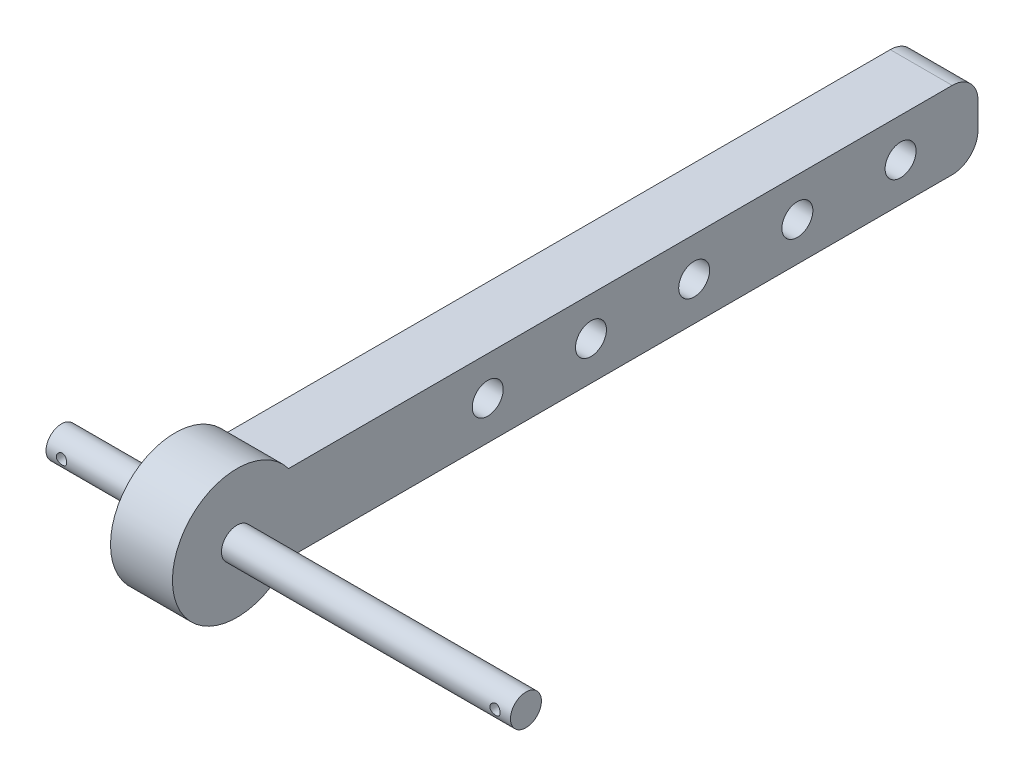
ISO-10303-21;
HEADER;
FILE_DESCRIPTION(('STEP AP214'),'2;1');
FILE_NAME('part.step','',(''),(''),'','','');
FILE_SCHEMA(('AUTOMOTIVE_DESIGN { 1 0 10303 214 1 1 1 1 }'));
ENDSEC;
DATA;
#1=APPLICATION_CONTEXT('core data for automotive mechanical design processes');
#2=APPLICATION_PROTOCOL_DEFINITION('international standard','automotive_design',2000,#1);
#3=PRODUCT_CONTEXT('',#1,'mechanical');
#4=PRODUCT('Part','Part','',(#3));
#5=PRODUCT_RELATED_PRODUCT_CATEGORY('part','',(#4));
#6=PRODUCT_DEFINITION_FORMATION('','',#4);
#7=PRODUCT_DEFINITION_CONTEXT('part definition',#1,'design');
#8=PRODUCT_DEFINITION('design','',#6,#7);
#9=PRODUCT_DEFINITION_SHAPE('','',#8);
#10=(LENGTH_UNIT() NAMED_UNIT(*) SI_UNIT(.MILLI.,.METRE.));
#11=(NAMED_UNIT(*) PLANE_ANGLE_UNIT() SI_UNIT($,.RADIAN.));
#12=(NAMED_UNIT(*) SI_UNIT($,.STERADIAN.) SOLID_ANGLE_UNIT());
#13=UNCERTAINTY_MEASURE_WITH_UNIT(LENGTH_MEASURE(1.E-05),#10,'distance_accuracy_value','');
#14=(GEOMETRIC_REPRESENTATION_CONTEXT(3) GLOBAL_UNCERTAINTY_ASSIGNED_CONTEXT((#13)) GLOBAL_UNIT_ASSIGNED_CONTEXT((#10,
#11,#12)) REPRESENTATION_CONTEXT('',''));
#15=CARTESIAN_POINT('',(0.,0.,0.));
#16=DIRECTION('',(0.,0.,1.));
#17=DIRECTION('',(1.,0.,0.));
#18=AXIS2_PLACEMENT_3D('',#15,#16,#17);
#19=CARTESIAN_POINT('',(12.,0.,0.));
#20=DIRECTION('',(0.,1.,0.));
#21=DIRECTION('',(0.,0.,1.));
#22=AXIS2_PLACEMENT_3D('',#19,#20,#21);
#23=PLANE('',#22);
#24=DIRECTION('',(0.,0.,-1.));
#25=VECTOR('',#24,1.);
#26=CARTESIAN_POINT('',(12.,0.,0.));
#27=LINE('',#26,#25);
#28=CARTESIAN_POINT('',(12.,0.,-16.4));
#29=VERTEX_POINT('',#28);
#30=CARTESIAN_POINT('',(12.,0.,-145.));
#31=VERTEX_POINT('',#30);
#32=EDGE_CURVE('E61',#29,#31,#27,.T.);
#33=ORIENTED_EDGE('',*,*,#32,.F.);
#34=DIRECTION('',(1.,0.,0.));
#35=VECTOR('',#34,1.);
#36=CARTESIAN_POINT('',(-35.3553390593274,0.,-16.4));
#37=LINE('',#36,#35);
#38=CARTESIAN_POINT('',(0.,0.,-16.4));
#39=VERTEX_POINT('',#38);
#40=EDGE_CURVE('E98',#29,#39,#37,.F.);
#41=ORIENTED_EDGE('',*,*,#40,.T.);
#42=DIRECTION('',(0.,0.,-1.));
#43=VECTOR('',#42,1.);
#44=CARTESIAN_POINT('',(0.,0.,0.));
#45=LINE('',#44,#43);
#46=CARTESIAN_POINT('',(0.,0.,-145.));
#47=VERTEX_POINT('',#46);
#48=EDGE_CURVE('E120',#39,#47,#45,.T.);
#49=ORIENTED_EDGE('',*,*,#48,.T.);
#50=DIRECTION('',(-1.,0.,0.));
#51=VECTOR('',#50,1.);
#52=CARTESIAN_POINT('',(12.,0.,-145.));
#53=LINE('',#52,#51);
#54=EDGE_CURVE('E133',#47,#31,#53,.F.);
#55=ORIENTED_EDGE('',*,*,#54,.T.);
#56=EDGE_LOOP('',(#33,#41,#49,#55));
#57=FACE_BOUND('',#56,.T.);
#58=ADVANCED_FACE('F39',(#57),#23,.F.);
#59=CARTESIAN_POINT('',(12.,0.,-150.));
#60=DIRECTION('',(0.,0.,1.));
#61=DIRECTION('',(1.,0.,0.));
#62=AXIS2_PLACEMENT_3D('',#59,#60,#61);
#63=PLANE('',#62);
#64=DIRECTION('',(0.,1.,0.));
#65=VECTOR('',#64,1.);
#66=CARTESIAN_POINT('',(12.,0.,-150.));
#67=LINE('',#66,#65);
#68=CARTESIAN_POINT('',(12.,5.,-150.));
#69=VERTEX_POINT('',#68);
#70=CARTESIAN_POINT('',(12.,10.,-150.));
#71=VERTEX_POINT('',#70);
#72=EDGE_CURVE('E113',#69,#71,#67,.T.);
#73=ORIENTED_EDGE('',*,*,#72,.F.);
#74=DIRECTION('',(-1.,0.,0.));
#75=VECTOR('',#74,1.);
#76=CARTESIAN_POINT('',(12.,5.,-150.));
#77=LINE('',#76,#75);
#78=CARTESIAN_POINT('',(0.,5.,-150.));
#79=VERTEX_POINT('',#78);
#80=EDGE_CURVE('E115',#69,#79,#77,.T.);
#81=ORIENTED_EDGE('',*,*,#80,.T.);
#82=DIRECTION('',(0.,1.,0.));
#83=VECTOR('',#82,1.);
#84=CARTESIAN_POINT('',(0.,0.,-150.));
#85=LINE('',#84,#83);
#86=CARTESIAN_POINT('',(0.,10.,-150.));
#87=VERTEX_POINT('',#86);
#88=EDGE_CURVE('E122',#79,#87,#85,.T.);
#89=ORIENTED_EDGE('',*,*,#88,.T.);
#90=DIRECTION('',(-1.,0.,0.));
#91=VECTOR('',#90,1.);
#92=CARTESIAN_POINT('',(12.,10.,-150.));
#93=LINE('',#92,#91);
#94=EDGE_CURVE('E112',#87,#71,#93,.F.);
#95=ORIENTED_EDGE('',*,*,#94,.T.);
#96=EDGE_LOOP('',(#73,#81,#89,#95));
#97=FACE_BOUND('',#96,.T.);
#98=ADVANCED_FACE('F153',(#97),#63,.F.);
#99=CARTESIAN_POINT('',(12.,15.,0.));
#100=DIRECTION('',(0.,-1.,0.));
#101=DIRECTION('',(0.,0.,-1.));
#102=AXIS2_PLACEMENT_3D('',#99,#100,#101);
#103=PLANE('',#102);
#104=DIRECTION('',(0.,0.,1.));
#105=VECTOR('',#104,1.);
#106=CARTESIAN_POINT('',(0.,15.,0.));
#107=LINE('',#106,#105);
#108=CARTESIAN_POINT('',(0.,15.,-145.));
#109=VERTEX_POINT('',#108);
#110=CARTESIAN_POINT('',(0.,15.,-16.4));
#111=VERTEX_POINT('',#110);
#112=EDGE_CURVE('E109',#109,#111,#107,.T.);
#113=ORIENTED_EDGE('',*,*,#112,.T.);
#114=DIRECTION('',(1.,0.,0.));
#115=VECTOR('',#114,1.);
#116=CARTESIAN_POINT('',(-35.3553390593274,15.,-16.4));
#117=LINE('',#116,#115);
#118=CARTESIAN_POINT('',(12.,15.,-16.4));
#119=VERTEX_POINT('',#118);
#120=EDGE_CURVE('E95',#111,#119,#117,.T.);
#121=ORIENTED_EDGE('',*,*,#120,.T.);
#122=DIRECTION('',(0.,0.,1.));
#123=VECTOR('',#122,1.);
#124=CARTESIAN_POINT('',(12.,15.,0.));
#125=LINE('',#124,#123);
#126=CARTESIAN_POINT('',(12.,15.,-145.));
#127=VERTEX_POINT('',#126);
#128=EDGE_CURVE('E106',#127,#119,#125,.T.);
#129=ORIENTED_EDGE('',*,*,#128,.F.);
#130=DIRECTION('',(-1.,0.,0.));
#131=VECTOR('',#130,1.);
#132=CARTESIAN_POINT('',(12.,15.,-145.));
#133=LINE('',#132,#131);
#134=EDGE_CURVE('E47',#127,#109,#133,.T.);
#135=ORIENTED_EDGE('',*,*,#134,.T.);
#136=EDGE_LOOP('',(#113,#121,#129,#135));
#137=FACE_BOUND('',#136,.T.);
#138=ADVANCED_FACE('F104',(#137),#103,.F.);
#139=CARTESIAN_POINT('',(12.,0.,0.));
#140=DIRECTION('',(-1.,0.,0.));
#141=DIRECTION('',(0.,0.,1.));
#142=AXIS2_PLACEMENT_3D('',#139,#140,#141);
#143=PLANE('',#142);
#144=CARTESIAN_POINT('',(12.,7.5,-135.));
#145=DIRECTION('',(-1.,0.,0.));
#146=DIRECTION('',(0.,0.,1.));
#147=AXIS2_PLACEMENT_3D('',#144,#145,#146);
#148=CIRCLE('',#147,2.99999999999999);
#149=CARTESIAN_POINT('',(12.,7.5,-132.));
#150=VERTEX_POINT('',#149);
#151=EDGE_CURVE('E233',#150,#150,#148,.F.);
#152=ORIENTED_EDGE('',*,*,#151,.F.);
#153=EDGE_LOOP('',(#152));
#154=FACE_BOUND('',#153,.T.);
#155=CARTESIAN_POINT('',(12.,7.5,-115.));
#156=DIRECTION('',(-1.,0.,0.));
#157=DIRECTION('',(0.,0.,1.));
#158=AXIS2_PLACEMENT_3D('',#155,#156,#157);
#159=CIRCLE('',#158,3.00000000000001);
#160=CARTESIAN_POINT('',(12.,7.5,-112.));
#161=VERTEX_POINT('',#160);
#162=EDGE_CURVE('E240',#161,#161,#159,.F.);
#163=ORIENTED_EDGE('',*,*,#162,.F.);
#164=EDGE_LOOP('',(#163));
#165=FACE_BOUND('',#164,.T.);
#166=CARTESIAN_POINT('',(12.,7.5,-95.));
#167=DIRECTION('',(-1.,0.,0.));
#168=DIRECTION('',(0.,0.,1.));
#169=AXIS2_PLACEMENT_3D('',#166,#167,#168);
#170=CIRCLE('',#169,3.00000000000001);
#171=CARTESIAN_POINT('',(12.,7.5,-92.));
#172=VERTEX_POINT('',#171);
#173=EDGE_CURVE('E246',#172,#172,#170,.F.);
#174=ORIENTED_EDGE('',*,*,#173,.F.);
#175=EDGE_LOOP('',(#174));
#176=FACE_BOUND('',#175,.T.);
#177=CARTESIAN_POINT('',(12.,7.5,-75.));
#178=DIRECTION('',(-1.,0.,0.));
#179=DIRECTION('',(0.,0.,1.));
#180=AXIS2_PLACEMENT_3D('',#177,#178,#179);
#181=CIRCLE('',#180,3.00000000000001);
#182=CARTESIAN_POINT('',(12.,7.5,-72.));
#183=VERTEX_POINT('',#182);
#184=EDGE_CURVE('E252',#183,#183,#181,.F.);
#185=ORIENTED_EDGE('',*,*,#184,.F.);
#186=EDGE_LOOP('',(#185));
#187=FACE_BOUND('',#186,.T.);
#188=CARTESIAN_POINT('',(12.,7.5,-55.));
#189=DIRECTION('',(-1.,0.,0.));
#190=DIRECTION('',(0.,0.,1.));
#191=AXIS2_PLACEMENT_3D('',#188,#189,#190);
#192=CIRCLE('',#191,3.);
#193=CARTESIAN_POINT('',(12.,7.5,-52.));
#194=VERTEX_POINT('',#193);
#195=EDGE_CURVE('E258',#194,#194,#192,.F.);
#196=ORIENTED_EDGE('',*,*,#195,.F.);
#197=EDGE_LOOP('',(#196));
#198=FACE_BOUND('',#197,.T.);
#199=CARTESIAN_POINT('',(12.,7.5,-6.4));
#200=DIRECTION('',(-1.,0.,0.));
#201=DIRECTION('',(0.,0.,1.));
#202=AXIS2_PLACEMENT_3D('',#199,#200,#201);
#203=CIRCLE('',#202,3.);
#204=CARTESIAN_POINT('',(12.,7.5,-3.4));
#205=VERTEX_POINT('',#204);
#206=EDGE_CURVE('E100',#205,#205,#203,.T.);
#207=ORIENTED_EDGE('',*,*,#206,.T.);
#208=EDGE_LOOP('',(#207));
#209=FACE_BOUND('',#208,.T.);
#210=CARTESIAN_POINT('',(12.,7.5,-6.4));
#211=DIRECTION('',(1.,0.,0.));
#212=DIRECTION('',(0.,0.,-1.));
#213=AXIS2_PLACEMENT_3D('',#210,#211,#212);
#214=CIRCLE('',#213,12.5);
#215=EDGE_CURVE('E92',#119,#29,#214,.T.);
#216=ORIENTED_EDGE('',*,*,#215,.T.);
#217=ORIENTED_EDGE('',*,*,#32,.T.);
#218=CARTESIAN_POINT('',(12.,5.,-145.));
#219=DIRECTION('',(-1.,0.,0.));
#220=DIRECTION('',(0.,0.,1.));
#221=AXIS2_PLACEMENT_3D('',#218,#219,#220);
#222=CIRCLE('',#221,5.);
#223=EDGE_CURVE('E136',#31,#69,#222,.F.);
#224=ORIENTED_EDGE('',*,*,#223,.T.);
#225=ORIENTED_EDGE('',*,*,#72,.T.);
#226=CARTESIAN_POINT('',(12.,10.,-145.));
#227=DIRECTION('',(-1.,0.,0.));
#228=DIRECTION('',(0.,0.,1.));
#229=AXIS2_PLACEMENT_3D('',#226,#227,#228);
#230=CIRCLE('',#229,5.);
#231=EDGE_CURVE('E54',#71,#127,#230,.F.);
#232=ORIENTED_EDGE('',*,*,#231,.T.);
#233=ORIENTED_EDGE('',*,*,#128,.T.);
#234=EDGE_LOOP('',(#216,#217,#224,#225,#232,#233));
#235=FACE_BOUND('',#234,.T.);
#236=ADVANCED_FACE('F111',(#154,#165,#176,#187,#198,#209,#235),#143,.F.);
#237=CARTESIAN_POINT('',(0.,0.,0.));
#238=DIRECTION('',(-1.,0.,0.));
#239=DIRECTION('',(0.,0.,1.));
#240=AXIS2_PLACEMENT_3D('',#237,#238,#239);
#241=PLANE('',#240);
#242=CARTESIAN_POINT('',(0.,7.5,-135.));
#243=DIRECTION('',(-1.,0.,0.));
#244=DIRECTION('',(0.,0.,1.));
#245=AXIS2_PLACEMENT_3D('',#242,#243,#244);
#246=CIRCLE('',#245,2.99999999999999);
#247=CARTESIAN_POINT('',(0.,7.5,-132.));
#248=VERTEX_POINT('',#247);
#249=EDGE_CURVE('E235',#248,#248,#246,.T.);
#250=ORIENTED_EDGE('',*,*,#249,.F.);
#251=EDGE_LOOP('',(#250));
#252=FACE_BOUND('',#251,.T.);
#253=CARTESIAN_POINT('',(0.,7.5,-115.));
#254=DIRECTION('',(-1.,0.,0.));
#255=DIRECTION('',(0.,0.,1.));
#256=AXIS2_PLACEMENT_3D('',#253,#254,#255);
#257=CIRCLE('',#256,3.00000000000001);
#258=CARTESIAN_POINT('',(0.,7.5,-112.));
#259=VERTEX_POINT('',#258);
#260=EDGE_CURVE('E243',#259,#259,#257,.T.);
#261=ORIENTED_EDGE('',*,*,#260,.F.);
#262=EDGE_LOOP('',(#261));
#263=FACE_BOUND('',#262,.T.);
#264=CARTESIAN_POINT('',(0.,7.5,-95.));
#265=DIRECTION('',(-1.,0.,0.));
#266=DIRECTION('',(0.,0.,1.));
#267=AXIS2_PLACEMENT_3D('',#264,#265,#266);
#268=CIRCLE('',#267,3.00000000000001);
#269=CARTESIAN_POINT('',(0.,7.5,-92.));
#270=VERTEX_POINT('',#269);
#271=EDGE_CURVE('E249',#270,#270,#268,.T.);
#272=ORIENTED_EDGE('',*,*,#271,.F.);
#273=EDGE_LOOP('',(#272));
#274=FACE_BOUND('',#273,.T.);
#275=CARTESIAN_POINT('',(0.,7.5,-75.));
#276=DIRECTION('',(-1.,0.,0.));
#277=DIRECTION('',(0.,0.,1.));
#278=AXIS2_PLACEMENT_3D('',#275,#276,#277);
#279=CIRCLE('',#278,3.00000000000001);
#280=CARTESIAN_POINT('',(0.,7.5,-72.));
#281=VERTEX_POINT('',#280);
#282=EDGE_CURVE('E255',#281,#281,#279,.T.);
#283=ORIENTED_EDGE('',*,*,#282,.F.);
#284=EDGE_LOOP('',(#283));
#285=FACE_BOUND('',#284,.T.);
#286=CARTESIAN_POINT('',(0.,7.5,-55.));
#287=DIRECTION('',(-1.,0.,0.));
#288=DIRECTION('',(0.,0.,1.));
#289=AXIS2_PLACEMENT_3D('',#286,#287,#288);
#290=CIRCLE('',#289,3.);
#291=CARTESIAN_POINT('',(0.,7.5,-52.));
#292=VERTEX_POINT('',#291);
#293=EDGE_CURVE('E261',#292,#292,#290,.T.);
#294=ORIENTED_EDGE('',*,*,#293,.F.);
#295=EDGE_LOOP('',(#294));
#296=FACE_BOUND('',#295,.T.);
#297=CARTESIAN_POINT('',(0.,7.5,-6.4));
#298=DIRECTION('',(-1.,0.,0.));
#299=DIRECTION('',(0.,0.,1.));
#300=AXIS2_PLACEMENT_3D('',#297,#298,#299);
#301=CIRCLE('',#300,3.);
#302=CARTESIAN_POINT('',(0.,7.5,-3.4));
#303=VERTEX_POINT('',#302);
#304=EDGE_CURVE('E11',#303,#303,#301,.T.);
#305=ORIENTED_EDGE('',*,*,#304,.F.);
#306=EDGE_LOOP('',(#305));
#307=FACE_BOUND('',#306,.T.);
#308=ORIENTED_EDGE('',*,*,#48,.F.);
#309=CARTESIAN_POINT('',(0.,7.5,-6.4));
#310=DIRECTION('',(-1.,0.,0.));
#311=DIRECTION('',(0.,0.,1.));
#312=AXIS2_PLACEMENT_3D('',#309,#310,#311);
#313=CIRCLE('',#312,12.5);
#314=EDGE_CURVE('E99',#111,#39,#313,.F.);
#315=ORIENTED_EDGE('',*,*,#314,.F.);
#316=ORIENTED_EDGE('',*,*,#112,.F.);
#317=CARTESIAN_POINT('',(0.,10.,-145.));
#318=DIRECTION('',(-1.,0.,0.));
#319=DIRECTION('',(0.,0.,1.));
#320=AXIS2_PLACEMENT_3D('',#317,#318,#319);
#321=CIRCLE('',#320,5.);
#322=EDGE_CURVE('E128',#109,#87,#321,.T.);
#323=ORIENTED_EDGE('',*,*,#322,.T.);
#324=ORIENTED_EDGE('',*,*,#88,.F.);
#325=CARTESIAN_POINT('',(0.,5.,-145.));
#326=DIRECTION('',(-1.,0.,0.));
#327=DIRECTION('',(0.,0.,1.));
#328=AXIS2_PLACEMENT_3D('',#325,#326,#327);
#329=CIRCLE('',#328,5.);
#330=EDGE_CURVE('E130',#79,#47,#329,.T.);
#331=ORIENTED_EDGE('',*,*,#330,.T.);
#332=EDGE_LOOP('',(#308,#315,#316,#323,#324,#331));
#333=FACE_BOUND('',#332,.T.);
#334=ADVANCED_FACE('F140',(#252,#263,#274,#285,#296,#307,#333),#241,.T.);
#335=CARTESIAN_POINT('',(12.,5.,-145.));
#336=DIRECTION('',(-1.,0.,0.));
#337=DIRECTION('',(0.,0.,1.));
#338=AXIS2_PLACEMENT_3D('',#335,#336,#337);
#339=CYLINDRICAL_SURFACE('',#338,5.);
#340=ORIENTED_EDGE('',*,*,#223,.F.);
#341=ORIENTED_EDGE('',*,*,#54,.F.);
#342=ORIENTED_EDGE('',*,*,#330,.F.);
#343=ORIENTED_EDGE('',*,*,#80,.F.);
#344=EDGE_LOOP('',(#340,#341,#342,#343));
#345=FACE_BOUND('',#344,.T.);
#346=ADVANCED_FACE('F150',(#345),#339,.T.);
#347=CARTESIAN_POINT('',(12.,10.,-145.));
#348=DIRECTION('',(-1.,0.,0.));
#349=DIRECTION('',(0.,0.,1.));
#350=AXIS2_PLACEMENT_3D('',#347,#348,#349);
#351=CYLINDRICAL_SURFACE('',#350,5.);
#352=ORIENTED_EDGE('',*,*,#231,.F.);
#353=ORIENTED_EDGE('',*,*,#94,.F.);
#354=ORIENTED_EDGE('',*,*,#322,.F.);
#355=ORIENTED_EDGE('',*,*,#134,.F.);
#356=EDGE_LOOP('',(#352,#353,#354,#355));
#357=FACE_BOUND('',#356,.T.);
#358=ADVANCED_FACE('F41',(#357),#351,.T.);
#359=CARTESIAN_POINT('',(-35.3553390593274,7.5,-6.4));
#360=DIRECTION('',(1.,0.,0.));
#361=DIRECTION('',(0.,0.,-1.));
#362=AXIS2_PLACEMENT_3D('',#359,#360,#361);
#363=CYLINDRICAL_SURFACE('',#362,12.5);
#364=ORIENTED_EDGE('',*,*,#40,.F.);
#365=ORIENTED_EDGE('',*,*,#215,.F.);
#366=ORIENTED_EDGE('',*,*,#120,.F.);
#367=ORIENTED_EDGE('',*,*,#314,.T.);
#368=EDGE_LOOP('',(#364,#365,#366,#367));
#369=FACE_BOUND('',#368,.T.);
#370=ADVANCED_FACE('F94',(#369),#363,.T.);
#371=CARTESIAN_POINT('',(-22.,7.5,-6.4));
#372=DIRECTION('',(-1.,0.,0.));
#373=DIRECTION('',(0.,0.,1.));
#374=AXIS2_PLACEMENT_3D('',#371,#372,#373);
#375=PLANE('',#374);
#376=CARTESIAN_POINT('',(-22.,7.5,-6.4));
#377=DIRECTION('',(-1.,0.,0.));
#378=DIRECTION('',(0.,0.,1.));
#379=AXIS2_PLACEMENT_3D('',#376,#377,#378);
#380=CIRCLE('',#379,3.);
#381=CARTESIAN_POINT('',(-22.,7.5,-3.4));
#382=VERTEX_POINT('',#381);
#383=EDGE_CURVE('E212',#382,#382,#380,.T.);
#384=ORIENTED_EDGE('',*,*,#383,.T.);
#385=EDGE_LOOP('',(#384));
#386=FACE_BOUND('',#385,.T.);
#387=ADVANCED_FACE('F160',(#386),#375,.T.);
#388=CARTESIAN_POINT('',(68.,7.5,-6.4));
#389=DIRECTION('',(-1.,0.,0.));
#390=DIRECTION('',(0.,0.,1.));
#391=AXIS2_PLACEMENT_3D('',#388,#389,#390);
#392=CYLINDRICAL_SURFACE('',#391,3.);
#393=CARTESIAN_POINT('',(-18.,7.49999999999999,-3.39999999999999));
#394=CARTESIAN_POINT('',(-17.9999997462684,7.44543663711327,-3.39999984699056));
#395=CARTESIAN_POINT('',(-18.0044802661272,7.39087480546144,-3.40150230492455));
#396=CARTESIAN_POINT('',(-18.0222291088172,7.28335823912702,-3.4073478979672));
#397=CARTESIAN_POINT('',(-18.0354983439489,7.23040367188117,-3.41169132797848));
#398=CARTESIAN_POINT('',(-18.070319243384,7.12766721049821,-3.42274692093558));
#399=CARTESIAN_POINT('',(-18.0918570624593,7.07788017411395,-3.42945512269147));
#400=CARTESIAN_POINT('',(-18.1425411728383,6.98262506319466,-3.44455554282659));
#401=CARTESIAN_POINT('',(-18.1716889650026,6.93715784304128,-3.45294809332222));
#402=CARTESIAN_POINT('',(-18.2378258048588,6.85025832497772,-3.47085905556995));
#403=CARTESIAN_POINT('',(-18.2750312342605,6.80899629970168,-3.48040443536216));
#404=CARTESIAN_POINT('',(-18.3557671547066,6.7331673072979,-3.49939685216879));
#405=CARTESIAN_POINT('',(-18.3992990349285,6.69860181451052,-3.50884386709451));
#406=CARTESIAN_POINT('',(-18.4929851151965,6.63617505777213,-3.52686667522727));
#407=CARTESIAN_POINT('',(-18.5432937397321,6.60853514177895,-3.53540960724312));
#408=CARTESIAN_POINT('',(-18.6481760944586,6.56218112612226,-3.55024694581399));
#409=CARTESIAN_POINT('',(-18.7027485171627,6.54346430261322,-3.55654203839255));
#410=CARTESIAN_POINT('',(-18.8126732214967,6.51612653849082,-3.56588696730623));
#411=CARTESIAN_POINT('',(-18.8679372084891,6.50718655172822,-3.56903904230389));
#412=CARTESIAN_POINT('',(-18.9792637541559,6.49865887666551,-3.57204343370493));
#413=CARTESIAN_POINT('',(-19.0353260607092,6.49906829839527,-3.57189676977271));
#414=CARTESIAN_POINT('',(-19.143936630444,6.50898009629657,-3.5684098499182));
#415=CARTESIAN_POINT('',(-19.196528402919,6.51806608683299,-3.56521584132468));
#416=CARTESIAN_POINT('',(-19.2993934196068,6.54439383715057,-3.5562334227545));
#417=CARTESIAN_POINT('',(-19.3496663854351,6.56163657340812,-3.55044470215893));
#418=CARTESIAN_POINT('',(-19.4474127495915,6.60406094193978,-3.53682088868752));
#419=CARTESIAN_POINT('',(-19.4948280254695,6.62936595129272,-3.52895434206883));
#420=CARTESIAN_POINT('',(-19.5848709082797,6.68711089369685,-3.51207441424274));
#421=CARTESIAN_POINT('',(-19.6274971269334,6.71955288763598,-3.50306070209537));
#422=CARTESIAN_POINT('',(-19.7090915981608,6.79265066731775,-3.4843267083226));
#423=CARTESIAN_POINT('',(-19.7477526945091,6.83364684992367,-3.47459410645158));
#424=CARTESIAN_POINT('',(-19.8177312666634,6.92166043002992,-3.45593061612964));
#425=CARTESIAN_POINT('',(-19.8490480381645,6.96867840433917,-3.44699980461933));
#426=CARTESIAN_POINT('',(-19.9036963002351,7.06805238695372,-3.43082892062207));
#427=CARTESIAN_POINT('',(-19.9269454913407,7.12045672358365,-3.42360649991961));
#428=CARTESIAN_POINT('',(-19.9642031739557,7.22873091663548,-3.41179432855566));
#429=CARTESIAN_POINT('',(-19.9782148754234,7.28459956184503,-3.40720366345122));
#430=CARTESIAN_POINT('',(-19.9960556660224,7.39561617047068,-3.40132372928559));
#431=CARTESIAN_POINT('',(-20.0002998091728,7.45069040013514,-3.39989998166269));
#432=CARTESIAN_POINT('',(-19.9996673264015,7.56077506996022,-3.40011097305175));
#433=CARTESIAN_POINT('',(-19.9947922400201,7.61578551931963,-3.40174519580648));
#434=CARTESIAN_POINT('',(-19.976388092264,7.72251986630425,-3.40779975282886));
#435=CARTESIAN_POINT('',(-19.9631137939505,7.77429280683484,-3.41213801288772));
#436=CARTESIAN_POINT('',(-19.9286065555333,7.87485595857955,-3.42308153169966));
#437=CARTESIAN_POINT('',(-19.9073726005323,7.92364578850855,-3.42968707953459));
#438=CARTESIAN_POINT('',(-19.8569295681591,8.01828829639331,-3.44471068712573));
#439=CARTESIAN_POINT('',(-19.8275254067164,8.06402995921732,-3.45317185243695));
#440=CARTESIAN_POINT('',(-19.761805849987,8.15006483013539,-3.47094746084257));
#441=CARTESIAN_POINT('',(-19.7254883439698,8.19035636779488,-3.48026216408112));
#442=CARTESIAN_POINT('',(-19.6450212489917,8.266252507807,-3.49923152017527));
#443=CARTESIAN_POINT('',(-19.6005907730668,8.30156096924848,-3.50888238904844));
#444=CARTESIAN_POINT('',(-19.5062284321955,8.36425752232084,-3.52700026713019));
#445=CARTESIAN_POINT('',(-19.4562965213898,8.39164554792083,-3.5354672664688));
#446=CARTESIAN_POINT('',(-19.3523269846934,8.43759693042335,-3.55017608179692));
#447=CARTESIAN_POINT('',(-19.2982979207572,8.45617813219775,-3.55642239099368));
#448=CARTESIAN_POINT('',(-19.1876213498759,8.48389466679215,-3.56589167600866));
#449=CARTESIAN_POINT('',(-19.1309750345669,8.49303425496123,-3.56911601377301));
#450=CARTESIAN_POINT('',(-19.0198029039868,8.50127628247037,-3.57202141124929));
#451=CARTESIAN_POINT('',(-18.9653176597483,8.50087025731092,-3.57187599655701));
#452=CARTESIAN_POINT('',(-18.8572349251003,8.49124229345487,-3.5684873007644));
#453=CARTESIAN_POINT('',(-18.8036373820471,8.48202087945888,-3.56524420404116));
#454=CARTESIAN_POINT('',(-18.6998643369873,8.45537181312697,-3.55615475721056));
#455=CARTESIAN_POINT('',(-18.6496431749928,8.43810334601487,-3.55035901984486));
#456=CARTESIAN_POINT('',(-18.5527725930645,8.39597936576037,-3.53683601174566));
#457=CARTESIAN_POINT('',(-18.5061239688127,8.37112216855397,-3.52910831234703));
#458=CARTESIAN_POINT('',(-18.4155163300763,8.31326069258324,-3.5121717077594));
#459=CARTESIAN_POINT('',(-18.3717634981014,8.27994824276452,-3.50291288358396));
#460=CARTESIAN_POINT('',(-18.290310186616,8.20664288313569,-3.48416643716214));
#461=CARTESIAN_POINT('',(-18.252611424312,8.16664808445148,-3.47467875087482));
#462=CARTESIAN_POINT('',(-18.1828555877108,8.07924155692067,-3.45609969474607));
#463=CARTESIAN_POINT('',(-18.151075652249,8.03160151349972,-3.44703818198784));
#464=CARTESIAN_POINT('',(-18.0960095711494,7.93135735740662,-3.43074008827348));
#465=CARTESIAN_POINT('',(-18.072721254078,7.87875451813234,-3.4235030409206));
#466=CARTESIAN_POINT('',(-18.0362783675113,7.77249364720096,-3.41194484931468));
#467=CARTESIAN_POINT('',(-18.0227175337366,7.7189877576764,-3.4075078757748));
#468=CARTESIAN_POINT('',(-18.0045797193229,7.61032041601023,-3.40153592935775));
#469=CARTESIAN_POINT('',(-18.0000002565035,7.55515942556873,-3.40000015468093));
#470=CARTESIAN_POINT('',(-18.,7.49999999999999,-3.39999999999999));
#471=B_SPLINE_CURVE_WITH_KNOTS('',3,(#393,#394,#395,#396,#397,#398,#399,#400,#401,#402,#403,
#404,#405,#406,#407,#408,#409,#410,#411,#412,#413,#414,#415,#416,#417,#418,#419,#420,#421,#422,
#423,#424,#425,#426,#427,#428,#429,#430,#431,#432,#433,#434,#435,#436,#437,#438,#439,#440,#441,
#442,#443,#444,#445,#446,#447,#448,#449,#450,#451,#452,#453,#454,#455,#456,#457,#458,#459,#460,
#461,#462,#463,#464,#465,#466,#467,#468,#469,#470),.UNSPECIFIED.,.T.,.F.,(4,2,2,2,2,2,2,2,2,2,2,
2,2,2,2,2,2,2,2,2,2,2,2,2,2,2,2,2,2,2,2,2,2,2,2,2,2,2,4),(0.,0.16348710602601,0.326991185267521,
0.490222672870274,0.6534863777991,0.821846842827563,0.990244332875306,1.16348384823471,
1.33667044692834,1.5040192574184,1.67131633987486,1.83096826551281,1.99063930855482,
2.15288171155131,2.31517102558207,2.48593305811367,2.65671145966618,2.82918405650358,
3.00159668877209,3.1665358317517,3.33144713164177,3.49158157978214,3.65173645284104,
3.81610399843737,3.98052180821892,4.15241022880752,4.32430008234997,4.49584013824417,
4.66730284700846,4.82995666056619,4.99260079341186,5.15215587070228,5.31174638165788,
5.47830066681615,5.64490211113589,5.81799660824911,5.99104681142267,6.15636558363625,
6.32163866027951),.UNSPECIFIED.);
#472=CARTESIAN_POINT('',(-18.,7.49999999999999,-3.39999999999999));
#473=VERTEX_POINT('',#472);
#474=EDGE_CURVE('E211',#473,#473,#471,.T.);
#475=ORIENTED_EDGE('',*,*,#474,.T.);
#476=EDGE_LOOP('',(#475));
#477=FACE_BOUND('',#476,.T.);
#478=CARTESIAN_POINT('',(-18.,7.49999999999999,-9.39999999999999));
#479=CARTESIAN_POINT('',(-17.9999997462684,7.55456336288671,-9.40000015300942));
#480=CARTESIAN_POINT('',(-18.0044802661272,7.60912519453854,-9.39849769507545));
#481=CARTESIAN_POINT('',(-18.0222291088172,7.71664176087296,-9.39265210203282));
#482=CARTESIAN_POINT('',(-18.0354983439489,7.76959632811881,-9.38830867202153));
#483=CARTESIAN_POINT('',(-18.070319243384,7.87233278950176,-9.37725307906443));
#484=CARTESIAN_POINT('',(-18.0918570624593,7.92211982588602,-9.37054487730854));
#485=CARTESIAN_POINT('',(-18.1425411728383,8.01737493680531,-9.35544445717342));
#486=CARTESIAN_POINT('',(-18.1716889650026,8.06284215695869,-9.34705190667779));
#487=CARTESIAN_POINT('',(-18.2378258048588,8.14974167502226,-9.32914094443005));
#488=CARTESIAN_POINT('',(-18.2750312342605,8.1910037002983,-9.31959556463785));
#489=CARTESIAN_POINT('',(-18.3557671547066,8.26683269270207,-9.30060314783122));
#490=CARTESIAN_POINT('',(-18.3992990349285,8.30139818548945,-9.2911561329055));
#491=CARTESIAN_POINT('',(-18.4929851151965,8.36382494222785,-9.27313332477274));
#492=CARTESIAN_POINT('',(-18.5432937397321,8.39146485822102,-9.26459039275689));
#493=CARTESIAN_POINT('',(-18.6481760944586,8.43781887387771,-9.24975305418602));
#494=CARTESIAN_POINT('',(-18.7027485171627,8.45653569738675,-9.24345796160746));
#495=CARTESIAN_POINT('',(-18.8126732214967,8.48387346150915,-9.23411303269378));
#496=CARTESIAN_POINT('',(-18.8679372084891,8.49281344827176,-9.23096095769612));
#497=CARTESIAN_POINT('',(-18.9792637541559,8.50134112333447,-9.22795656629508));
#498=CARTESIAN_POINT('',(-19.0353260607092,8.50093170160471,-9.22810323022731));
#499=CARTESIAN_POINT('',(-19.143936630444,8.49101990370341,-9.23159015008181));
#500=CARTESIAN_POINT('',(-19.196528402919,8.48193391316699,-9.23478415867533));
#501=CARTESIAN_POINT('',(-19.2993934196068,8.45560616284941,-9.24376657724551));
#502=CARTESIAN_POINT('',(-19.3496663854351,8.43836342659186,-9.24955529784108));
#503=CARTESIAN_POINT('',(-19.4474127495915,8.3959390580602,-9.26317911131249));
#504=CARTESIAN_POINT('',(-19.4948280254695,8.37063404870725,-9.27104565793118));
#505=CARTESIAN_POINT('',(-19.5848709082797,8.31288910630313,-9.28792558575727));
#506=CARTESIAN_POINT('',(-19.6274971269334,8.280447112364,-9.29693929790464));
#507=CARTESIAN_POINT('',(-19.7090915981608,8.20734933268223,-9.31567329167741));
#508=CARTESIAN_POINT('',(-19.7477526945091,8.1663531500763,-9.32540589354843));
#509=CARTESIAN_POINT('',(-19.8177312666634,8.07833956997005,-9.34406938387037));
#510=CARTESIAN_POINT('',(-19.8490480381645,8.0313215956608,-9.35300019538068));
#511=CARTESIAN_POINT('',(-19.9036963002351,7.93194761304626,-9.36917107937794));
#512=CARTESIAN_POINT('',(-19.9269454913407,7.87954327641632,-9.3763935000804));
#513=CARTESIAN_POINT('',(-19.9642031739557,7.7712690833645,-9.38820567144435));
#514=CARTESIAN_POINT('',(-19.9782148754234,7.71540043815494,-9.39279633654879));
#515=CARTESIAN_POINT('',(-19.9960556660224,7.60438382952929,-9.39867627071441));
#516=CARTESIAN_POINT('',(-20.0002998091728,7.54930959986483,-9.40010001833731));
#517=CARTESIAN_POINT('',(-19.9996673264015,7.43922493003975,-9.39988902694825));
#518=CARTESIAN_POINT('',(-19.9947922400201,7.38421448068034,-9.39825480419352));
#519=CARTESIAN_POINT('',(-19.976388092264,7.27748013369573,-9.39220024717114));
#520=CARTESIAN_POINT('',(-19.9631137939505,7.22570719316513,-9.38786198711228));
#521=CARTESIAN_POINT('',(-19.9286065555333,7.12514404142043,-9.37691846830034));
#522=CARTESIAN_POINT('',(-19.9073726005323,7.07635421149143,-9.37031292046541));
#523=CARTESIAN_POINT('',(-19.8569295681591,6.98171170360667,-9.35528931287427));
#524=CARTESIAN_POINT('',(-19.8275254067164,6.93597004078266,-9.34682814756305));
#525=CARTESIAN_POINT('',(-19.7618058499869,6.84993516986458,-9.32905253915743));
#526=CARTESIAN_POINT('',(-19.7254883439698,6.8096436322051,-9.31973783591888));
#527=CARTESIAN_POINT('',(-19.6450212489917,6.73374749219298,-9.30076847982472));
#528=CARTESIAN_POINT('',(-19.6005907730668,6.6984390307515,-9.29111761095155));
#529=CARTESIAN_POINT('',(-19.5062284321955,6.63574247767913,-9.27299973286981));
#530=CARTESIAN_POINT('',(-19.4562965213898,6.60835445207915,-9.2645327335312));
#531=CARTESIAN_POINT('',(-19.3523269846934,6.56240306957663,-9.24982391820308));
#532=CARTESIAN_POINT('',(-19.2982979207572,6.54382186780222,-9.24357760900632));
#533=CARTESIAN_POINT('',(-19.1876213498759,6.51610533320783,-9.23410832399133));
#534=CARTESIAN_POINT('',(-19.1309750345669,6.50696574503874,-9.23088398622698));
#535=CARTESIAN_POINT('',(-19.0198029039868,6.49872371752961,-9.22797858875071));
#536=CARTESIAN_POINT('',(-18.9653176597483,6.49912974268906,-9.22812400344299));
#537=CARTESIAN_POINT('',(-18.8572349251003,6.50875770654511,-9.2315126992356));
#538=CARTESIAN_POINT('',(-18.8036373820471,6.5179791205411,-9.23475579595884));
#539=CARTESIAN_POINT('',(-18.6998643369873,6.54462818687301,-9.24384524278943));
#540=CARTESIAN_POINT('',(-18.6496431749928,6.56189665398511,-9.24964098015514));
#541=CARTESIAN_POINT('',(-18.5527725930645,6.60402063423961,-9.26316398825433));
#542=CARTESIAN_POINT('',(-18.5061239688127,6.62887783144601,-9.27089168765296));
#543=CARTESIAN_POINT('',(-18.4155163300763,6.68673930741674,-9.2878282922406));
#544=CARTESIAN_POINT('',(-18.3717634981014,6.72005175723545,-9.29708711641604));
#545=CARTESIAN_POINT('',(-18.290310186616,6.79335711686429,-9.31583356283786));
#546=CARTESIAN_POINT('',(-18.252611424312,6.83335191554849,-9.32532124912517));
#547=CARTESIAN_POINT('',(-18.1828555877108,6.92075844307931,-9.34390030525393));
#548=CARTESIAN_POINT('',(-18.151075652249,6.96839848650026,-9.35296181801216));
#549=CARTESIAN_POINT('',(-18.0960095711494,7.06864264259336,-9.36925991172652));
#550=CARTESIAN_POINT('',(-18.072721254078,7.12124548186764,-9.3764969590794));
#551=CARTESIAN_POINT('',(-18.0362783675113,7.22750635279901,-9.38805515068532));
#552=CARTESIAN_POINT('',(-18.0227175337366,7.28101224232358,-9.3924921242252));
#553=CARTESIAN_POINT('',(-18.0045797193229,7.38967958398974,-9.39846407064224));
#554=CARTESIAN_POINT('',(-18.0000002565035,7.44484057443124,-9.39999984531904));
#555=CARTESIAN_POINT('',(-18.,7.49999999999999,-9.39999999999999));
#556=B_SPLINE_CURVE_WITH_KNOTS('',3,(#478,#479,#480,#481,#482,#483,#484,#485,#486,#487,#488,
#489,#490,#491,#492,#493,#494,#495,#496,#497,#498,#499,#500,#501,#502,#503,#504,#505,#506,#507,
#508,#509,#510,#511,#512,#513,#514,#515,#516,#517,#518,#519,#520,#521,#522,#523,#524,#525,#526,
#527,#528,#529,#530,#531,#532,#533,#534,#535,#536,#537,#538,#539,#540,#541,#542,#543,#544,#545,
#546,#547,#548,#549,#550,#551,#552,#553,#554,#555),.UNSPECIFIED.,.T.,.F.,(4,2,2,2,2,2,2,2,2,2,2,
2,2,2,2,2,2,2,2,2,2,2,2,2,2,2,2,2,2,2,2,2,2,2,2,2,2,2,4),(0.,0.16348710602601,0.32699118526752,
0.490222672870271,0.653486377799099,0.821846842827562,0.990244332875304,1.16348384823471,
1.33667044692833,1.5040192574184,1.67131633987485,1.8309682655128,1.99063930855482,
2.15288171155131,2.31517102558207,2.48593305811367,2.65671145966618,2.82918405650358,
3.00159668877209,3.1665358317517,3.33144713164177,3.49158157978214,3.65173645284104,
3.81610399843737,3.98052180821891,4.15241022880752,4.32430008234997,4.49584013824416,
4.66730284700846,4.82995666056619,4.99260079341186,5.15215587070228,5.31174638165788,
5.47830066681615,5.64490211113589,5.81799660824911,5.99104681142267,6.15636558363624,
6.3216386602795),.UNSPECIFIED.);
#557=CARTESIAN_POINT('',(-18.,7.49999999999999,-9.39999999999999));
#558=VERTEX_POINT('',#557);
#559=EDGE_CURVE('E216',#558,#558,#556,.T.);
#560=ORIENTED_EDGE('',*,*,#559,.T.);
#561=EDGE_LOOP('',(#560));
#562=FACE_BOUND('',#561,.T.);
#563=ORIENTED_EDGE('',*,*,#304,.T.);
#564=EDGE_LOOP('',(#563));
#565=FACE_BOUND('',#564,.T.);
#566=ORIENTED_EDGE('',*,*,#383,.F.);
#567=EDGE_LOOP('',(#566));
#568=FACE_BOUND('',#567,.T.);
#569=ADVANCED_FACE('F177',(#477,#562,#565,#568),#392,.T.);
#570=CARTESIAN_POINT('',(66.,7.5,-3.39999999999999));
#571=CARTESIAN_POINT('',(66.0000002537316,7.44543663711328,-3.39999984699056));
#572=CARTESIAN_POINT('',(65.9955197338728,7.39087480546145,-3.40150230492455));
#573=CARTESIAN_POINT('',(65.9777708911828,7.28335823912703,-3.4073478979672));
#574=CARTESIAN_POINT('',(65.9645016560511,7.23040367188118,-3.41169132797848));
#575=CARTESIAN_POINT('',(65.929680756616,7.12766721049823,-3.42274692093557));
#576=CARTESIAN_POINT('',(65.9081429375407,7.07788017411397,-3.42945512269147));
#577=CARTESIAN_POINT('',(65.8574588271617,6.98262506319468,-3.44455554282658));
#578=CARTESIAN_POINT('',(65.8283110349974,6.93715784304129,-3.45294809332222));
#579=CARTESIAN_POINT('',(65.7621741951413,6.85025832497774,-3.47085905556995));
#580=CARTESIAN_POINT('',(65.7249687657395,6.8089962997017,-3.48040443536215));
#581=CARTESIAN_POINT('',(65.6442328452934,6.73316730729792,-3.49939685216879));
#582=CARTESIAN_POINT('',(65.6007009650715,6.69860181451054,-3.50884386709451));
#583=CARTESIAN_POINT('',(65.5070148848035,6.63617505777214,-3.52686667522726));
#584=CARTESIAN_POINT('',(65.4567062602679,6.60853514177897,-3.53540960724312));
#585=CARTESIAN_POINT('',(65.3518239055415,6.56218112612228,-3.55024694581399));
#586=CARTESIAN_POINT('',(65.2972514828373,6.54346430261324,-3.55654203839255));
#587=CARTESIAN_POINT('',(65.1873267785033,6.51612653849084,-3.56588696730623));
#588=CARTESIAN_POINT('',(65.1320627915109,6.50718655172823,-3.56903904230389));
#589=CARTESIAN_POINT('',(65.0207362458441,6.49865887666552,-3.57204343370493));
#590=CARTESIAN_POINT('',(64.9646739392908,6.49906829839528,-3.5718967697727));
#591=CARTESIAN_POINT('',(64.856063369556,6.50898009629658,-3.5684098499182));
#592=CARTESIAN_POINT('',(64.803471597081,6.51806608683301,-3.56521584132467));
#593=CARTESIAN_POINT('',(64.7006065803932,6.54439383715059,-3.55623342275449));
#594=CARTESIAN_POINT('',(64.6503336145649,6.56163657340813,-3.55044470215892));
#595=CARTESIAN_POINT('',(64.5525872504085,6.60406094193979,-3.53682088868751));
#596=CARTESIAN_POINT('',(64.5051719745305,6.62936595129274,-3.52895434206883));
#597=CARTESIAN_POINT('',(64.4151290917203,6.68711089369686,-3.51207441424274));
#598=CARTESIAN_POINT('',(64.3725028730666,6.719552887636,-3.50306070209537));
#599=CARTESIAN_POINT('',(64.2909084018392,6.79265066731776,-3.48432670832259));
#600=CARTESIAN_POINT('',(64.2522473054909,6.83364684992369,-3.47459410645157));
#601=CARTESIAN_POINT('',(64.1822687333366,6.92166043002994,-3.45593061612963));
#602=CARTESIAN_POINT('',(64.1509519618355,6.96867840433919,-3.44699980461933));
#603=CARTESIAN_POINT('',(64.0963036997649,7.06805238695374,-3.43082892062206));
#604=CARTESIAN_POINT('',(64.0730545086593,7.12045672358366,-3.42360649991961));
#605=CARTESIAN_POINT('',(64.0357968260443,7.22873091663549,-3.41179432855566));
#606=CARTESIAN_POINT('',(64.0217851245766,7.28459956184504,-3.40720366345122));
#607=CARTESIAN_POINT('',(64.0039443339777,7.39561617047069,-3.40132372928559));
#608=CARTESIAN_POINT('',(63.9997001908273,7.45069040013515,-3.39989998166269));
#609=CARTESIAN_POINT('',(64.0003326735985,7.56077506996023,-3.40011097305175));
#610=CARTESIAN_POINT('',(64.0052077599799,7.61578551931965,-3.40174519580648));
#611=CARTESIAN_POINT('',(64.023611907736,7.72251986630426,-3.40779975282886));
#612=CARTESIAN_POINT('',(64.0368862060495,7.77429280683486,-3.41213801288772));
#613=CARTESIAN_POINT('',(64.0713934444667,7.87485595857956,-3.42308153169966));
#614=CARTESIAN_POINT('',(64.0926273994677,7.92364578850856,-3.42968707953459));
#615=CARTESIAN_POINT('',(64.1430704318409,8.01828829639332,-3.44471068712573));
#616=CARTESIAN_POINT('',(64.1724745932836,8.06402995921733,-3.45317185243695));
#617=CARTESIAN_POINT('',(64.2381941500131,8.1500648301354,-3.47094746084257));
#618=CARTESIAN_POINT('',(64.2745116560302,8.19035636779489,-3.48026216408112));
#619=CARTESIAN_POINT('',(64.3549787510083,8.26625250780701,-3.49923152017528));
#620=CARTESIAN_POINT('',(64.3994092269333,8.30156096924849,-3.50888238904845));
#621=CARTESIAN_POINT('',(64.4937715678045,8.36425752232085,-3.52700026713019));
#622=CARTESIAN_POINT('',(64.5437034786102,8.39164554792084,-3.5354672664688));
#623=CARTESIAN_POINT('',(64.6476730153066,8.43759693042336,-3.55017608179692));
#624=CARTESIAN_POINT('',(64.7017020792428,8.45617813219776,-3.55642239099368));
#625=CARTESIAN_POINT('',(64.8123786501241,8.48389466679216,-3.56589167600867));
#626=CARTESIAN_POINT('',(64.8690249654331,8.49303425496124,-3.56911601377302));
#627=CARTESIAN_POINT('',(64.9801970960132,8.50127628247038,-3.57202141124929));
#628=CARTESIAN_POINT('',(65.0346823402517,8.50087025731093,-3.57187599655701));
#629=CARTESIAN_POINT('',(65.1427650748997,8.49124229345488,-3.5684873007644));
#630=CARTESIAN_POINT('',(65.1963626179529,8.48202087945889,-3.56524420404116));
#631=CARTESIAN_POINT('',(65.3001356630127,8.45537181312698,-3.55615475721057));
#632=CARTESIAN_POINT('',(65.3503568250072,8.43810334601488,-3.55035901984486));
#633=CARTESIAN_POINT('',(65.4472274069355,8.39597936576038,-3.53683601174566));
#634=CARTESIAN_POINT('',(65.4938760311873,8.37112216855397,-3.52910831234703));
#635=CARTESIAN_POINT('',(65.5844836699237,8.31326069258324,-3.5121717077594));
#636=CARTESIAN_POINT('',(65.6282365018986,8.27994824276452,-3.50291288358396));
#637=CARTESIAN_POINT('',(65.709689813384,8.20664288313569,-3.48416643716214));
#638=CARTESIAN_POINT('',(65.747388575688,8.1666480844515,-3.47467875087483));
#639=CARTESIAN_POINT('',(65.8171444122892,8.07924155692068,-3.45609969474607));
#640=CARTESIAN_POINT('',(65.848924347751,8.03160151349973,-3.44703818198784));
#641=CARTESIAN_POINT('',(65.9039904288506,7.93135735740663,-3.43074008827348));
#642=CARTESIAN_POINT('',(65.927278745922,7.87875451813235,-3.4235030409206));
#643=CARTESIAN_POINT('',(65.9637216324887,7.77249364720097,-3.41194484931468));
#644=CARTESIAN_POINT('',(65.9772824662634,7.71898775767641,-3.40750787577481));
#645=CARTESIAN_POINT('',(65.9954202806771,7.61032041601024,-3.40153592935775));
#646=CARTESIAN_POINT('',(65.9999997434965,7.55515942556874,-3.40000015468093));
#647=CARTESIAN_POINT('',(66.,7.5,-3.39999999999999));
#648=B_SPLINE_CURVE_WITH_KNOTS('',3,(#570,#571,#572,#573,#574,#575,#576,#577,#578,#579,#580,
#581,#582,#583,#584,#585,#586,#587,#588,#589,#590,#591,#592,#593,#594,#595,#596,#597,#598,#599,
#600,#601,#602,#603,#604,#605,#606,#607,#608,#609,#610,#611,#612,#613,#614,#615,#616,#617,#618,
#619,#620,#621,#622,#623,#624,#625,#626,#627,#628,#629,#630,#631,#632,#633,#634,#635,#636,#637,
#638,#639,#640,#641,#642,#643,#644,#645,#646,#647),.UNSPECIFIED.,.T.,.F.,(4,2,2,2,2,2,2,2,2,2,2,
2,2,2,2,2,2,2,2,2,2,2,2,2,2,2,2,2,2,2,2,2,2,2,2,2,2,2,4),(0.,0.163487106026013,0.32699118526752,
0.490222672870268,0.653486377799097,0.821846842827546,0.990244332875298,1.1634838482347,
1.33667044692833,1.50401925741839,1.67131633987485,1.83096826551281,1.99063930855482,
2.15288171155131,2.31517102558207,2.48593305811367,2.65671145966619,2.82918405650357,
3.00159668877208,3.16653583175169,3.33144713164176,3.49158157978213,3.65173645284104,
3.81610399843736,3.98052180821891,4.15241022880751,4.32430008234996,4.49584013824415,
4.66730284700844,4.82995666056617,4.99260079341184,5.15215587070227,5.31174638165789,
5.47830066681614,5.64490211113588,5.81799660824909,5.99104681142266,6.15636558363623,
6.32163866027949),.UNSPECIFIED.);
#649=CARTESIAN_POINT('',(66.,7.5,-3.39999999999999));
#650=VERTEX_POINT('',#649);
#651=EDGE_CURVE('E199',#650,#650,#648,.T.);
#652=ORIENTED_EDGE('',*,*,#651,.T.);
#653=EDGE_LOOP('',(#652));
#654=FACE_BOUND('',#653,.T.);
#655=CARTESIAN_POINT('',(66.,7.5,-9.39999999999999));
#656=CARTESIAN_POINT('',(66.0000002537316,7.55456336288672,-9.40000015300942));
#657=CARTESIAN_POINT('',(65.9955197338728,7.60912519453855,-9.39849769507545));
#658=CARTESIAN_POINT('',(65.9777708911828,7.71664176087297,-9.39265210203281));
#659=CARTESIAN_POINT('',(65.9645016560511,7.76959632811882,-9.38830867202153));
#660=CARTESIAN_POINT('',(65.929680756616,7.87233278950177,-9.37725307906443));
#661=CARTESIAN_POINT('',(65.9081429375407,7.92211982588603,-9.37054487730854));
#662=CARTESIAN_POINT('',(65.8574588271617,8.01737493680532,-9.35544445717342));
#663=CARTESIAN_POINT('',(65.8283110349974,8.06284215695871,-9.34705190667778));
#664=CARTESIAN_POINT('',(65.7621741951413,8.14974167502227,-9.32914094443005));
#665=CARTESIAN_POINT('',(65.7249687657395,8.19100370029831,-9.31959556463785));
#666=CARTESIAN_POINT('',(65.6442328452934,8.26683269270208,-9.30060314783122));
#667=CARTESIAN_POINT('',(65.6007009650715,8.30139818548946,-9.29115613290549));
#668=CARTESIAN_POINT('',(65.5070148848035,8.36382494222786,-9.27313332477274));
#669=CARTESIAN_POINT('',(65.4567062602679,8.39146485822103,-9.26459039275688));
#670=CARTESIAN_POINT('',(65.3518239055415,8.43781887387772,-9.24975305418601));
#671=CARTESIAN_POINT('',(65.2972514828373,8.45653569738676,-9.24345796160746));
#672=CARTESIAN_POINT('',(65.1873267785033,8.48387346150916,-9.23411303269378));
#673=CARTESIAN_POINT('',(65.1320627915109,8.49281344827177,-9.23096095769612));
#674=CARTESIAN_POINT('',(65.0207362458441,8.50134112333448,-9.22795656629508));
#675=CARTESIAN_POINT('',(64.9646739392908,8.50093170160472,-9.2281032302273));
#676=CARTESIAN_POINT('',(64.856063369556,8.49101990370342,-9.2315901500818));
#677=CARTESIAN_POINT('',(64.803471597081,8.48193391316699,-9.23478415867533));
#678=CARTESIAN_POINT('',(64.7006065803932,8.45560616284941,-9.24376657724551));
#679=CARTESIAN_POINT('',(64.6503336145649,8.43836342659187,-9.24955529784108));
#680=CARTESIAN_POINT('',(64.5525872504085,8.39593905806021,-9.26317911131249));
#681=CARTESIAN_POINT('',(64.5051719745305,8.37063404870726,-9.27104565793118));
#682=CARTESIAN_POINT('',(64.4151290917203,8.31288910630314,-9.28792558575727));
#683=CARTESIAN_POINT('',(64.3725028730666,8.280447112364,-9.29693929790464));
#684=CARTESIAN_POINT('',(64.2909084018392,8.20734933268224,-9.31567329167741));
#685=CARTESIAN_POINT('',(64.2522473054909,8.16635315007631,-9.32540589354843));
#686=CARTESIAN_POINT('',(64.1822687333366,8.07833956997006,-9.34406938387037));
#687=CARTESIAN_POINT('',(64.1509519618355,8.03132159566081,-9.35300019538067));
#688=CARTESIAN_POINT('',(64.0963036997649,7.93194761304627,-9.36917107937794));
#689=CARTESIAN_POINT('',(64.0730545086593,7.87954327641634,-9.3763935000804));
#690=CARTESIAN_POINT('',(64.0357968260443,7.77126908336451,-9.38820567144435));
#691=CARTESIAN_POINT('',(64.0217851245766,7.71540043815495,-9.39279633654879));
#692=CARTESIAN_POINT('',(64.0039443339777,7.60438382952931,-9.39867627071441));
#693=CARTESIAN_POINT('',(63.9997001908273,7.54930959986485,-9.40010001833731));
#694=CARTESIAN_POINT('',(64.0003326735985,7.43922493003977,-9.39988902694825));
#695=CARTESIAN_POINT('',(64.0052077599799,7.38421448068035,-9.39825480419352));
#696=CARTESIAN_POINT('',(64.023611907736,7.27748013369574,-9.39220024717114));
#697=CARTESIAN_POINT('',(64.0368862060495,7.22570719316514,-9.38786198711228));
#698=CARTESIAN_POINT('',(64.0713934444667,7.12514404142044,-9.37691846830034));
#699=CARTESIAN_POINT('',(64.0926273994677,7.07635421149144,-9.37031292046541));
#700=CARTESIAN_POINT('',(64.1430704318409,6.98171170360668,-9.35528931287427));
#701=CARTESIAN_POINT('',(64.1724745932836,6.93597004078267,-9.34682814756305));
#702=CARTESIAN_POINT('',(64.2381941500131,6.8499351698646,-9.32905253915744));
#703=CARTESIAN_POINT('',(64.2745116560302,6.80964363220511,-9.31973783591888));
#704=CARTESIAN_POINT('',(64.3549787510083,6.73374749219299,-9.30076847982473));
#705=CARTESIAN_POINT('',(64.3994092269333,6.69843903075151,-9.29111761095156));
#706=CARTESIAN_POINT('',(64.4937715678045,6.63574247767915,-9.27299973286981));
#707=CARTESIAN_POINT('',(64.5437034786102,6.60835445207916,-9.2645327335312));
#708=CARTESIAN_POINT('',(64.6476730153066,6.56240306957664,-9.24982391820308));
#709=CARTESIAN_POINT('',(64.7017020792428,6.54382186780224,-9.24357760900632));
#710=CARTESIAN_POINT('',(64.8123786501242,6.51610533320784,-9.23410832399134));
#711=CARTESIAN_POINT('',(64.8690249654331,6.50696574503876,-9.23088398622699));
#712=CARTESIAN_POINT('',(64.9801970960132,6.49872371752962,-9.22797858875071));
#713=CARTESIAN_POINT('',(65.0346823402517,6.49912974268907,-9.22812400344299));
#714=CARTESIAN_POINT('',(65.1427650748997,6.50875770654512,-9.2315126992356));
#715=CARTESIAN_POINT('',(65.1963626179529,6.51797912054111,-9.23475579595885));
#716=CARTESIAN_POINT('',(65.3001356630127,6.54462818687302,-9.24384524278944));
#717=CARTESIAN_POINT('',(65.3503568250072,6.56189665398512,-9.24964098015514));
#718=CARTESIAN_POINT('',(65.4472274069355,6.60402063423962,-9.26316398825434));
#719=CARTESIAN_POINT('',(65.4938760311873,6.62887783144603,-9.27089168765297));
#720=CARTESIAN_POINT('',(65.5844836699237,6.68673930741676,-9.2878282922406));
#721=CARTESIAN_POINT('',(65.6282365018986,6.72005175723547,-9.29708711641604));
#722=CARTESIAN_POINT('',(65.709689813384,6.7933571168643,-9.31583356283786));
#723=CARTESIAN_POINT('',(65.747388575688,6.8333519155485,-9.32532124912518));
#724=CARTESIAN_POINT('',(65.8171444122892,6.92075844307932,-9.34390030525393));
#725=CARTESIAN_POINT('',(65.848924347751,6.96839848650028,-9.35296181801217));
#726=CARTESIAN_POINT('',(65.9039904288506,7.06864264259338,-9.36925991172652));
#727=CARTESIAN_POINT('',(65.927278745922,7.12124548186765,-9.3764969590794));
#728=CARTESIAN_POINT('',(65.9637216324887,7.22750635279903,-9.38805515068532));
#729=CARTESIAN_POINT('',(65.9772824662634,7.28101224232359,-9.39249212422521));
#730=CARTESIAN_POINT('',(65.9954202806771,7.38967958398975,-9.39846407064224));
#731=CARTESIAN_POINT('',(65.9999997434965,7.44484057443125,-9.39999984531905));
#732=CARTESIAN_POINT('',(66.,7.5,-9.39999999999999));
#733=B_SPLINE_CURVE_WITH_KNOTS('',3,(#655,#656,#657,#658,#659,#660,#661,#662,#663,#664,#665,
#666,#667,#668,#669,#670,#671,#672,#673,#674,#675,#676,#677,#678,#679,#680,#681,#682,#683,#684,
#685,#686,#687,#688,#689,#690,#691,#692,#693,#694,#695,#696,#697,#698,#699,#700,#701,#702,#703,
#704,#705,#706,#707,#708,#709,#710,#711,#712,#713,#714,#715,#716,#717,#718,#719,#720,#721,#722,
#723,#724,#725,#726,#727,#728,#729,#730,#731,#732),.UNSPECIFIED.,.T.,.F.,(4,2,2,2,2,2,2,2,2,2,2,
2,2,2,2,2,2,2,2,2,2,2,2,2,2,2,2,2,2,2,2,2,2,2,2,2,2,2,4),(0.,0.163487106026012,
0.326991185267519,0.490222672870266,0.653486377799097,0.821846842827561,0.99024433287531,
1.1634838482347,1.33667044692833,1.50401925741839,1.67131633987485,1.83096826551281,
1.99063930855482,2.15288171155131,2.31517102558207,2.48593305811366,2.65671145966618,
2.82918405650357,3.00159668877207,3.16653583175169,3.33144713164176,3.49158157978213,
3.65173645284103,3.81610399843736,3.98052180821891,4.1524102288075,4.32430008234996,
4.49584013824415,4.66730284700845,4.82995666056617,4.99260079341184,5.15215587070227,
5.31174638165788,5.47830066681614,5.64490211113587,5.8179966082491,5.99104681142266,
6.15636558363623,6.32163866027949),.UNSPECIFIED.);
#734=CARTESIAN_POINT('',(66.,7.5,-9.39999999999999));
#735=VERTEX_POINT('',#734);
#736=EDGE_CURVE('E205',#735,#735,#733,.T.);
#737=ORIENTED_EDGE('',*,*,#736,.T.);
#738=EDGE_LOOP('',(#737));
#739=FACE_BOUND('',#738,.T.);
#740=CARTESIAN_POINT('',(68.,7.5,-6.4));
#741=DIRECTION('',(-1.,0.,0.));
#742=DIRECTION('',(0.,0.,1.));
#743=AXIS2_PLACEMENT_3D('',#740,#741,#742);
#744=CIRCLE('',#743,3.);
#745=CARTESIAN_POINT('',(68.,7.5,-3.4));
#746=VERTEX_POINT('',#745);
#747=EDGE_CURVE('E215',#746,#746,#744,.T.);
#748=ORIENTED_EDGE('',*,*,#747,.T.);
#749=EDGE_LOOP('',(#748));
#750=FACE_BOUND('',#749,.T.);
#751=ORIENTED_EDGE('',*,*,#206,.F.);
#752=EDGE_LOOP('',(#751));
#753=FACE_BOUND('',#752,.T.);
#754=ADVANCED_FACE('F180',(#654,#739,#750,#753),#392,.T.);
#755=CARTESIAN_POINT('',(68.,7.5,-6.4));
#756=DIRECTION('',(-1.,0.,0.));
#757=DIRECTION('',(0.,0.,1.));
#758=AXIS2_PLACEMENT_3D('',#755,#756,#757);
#759=PLANE('',#758);
#760=ORIENTED_EDGE('',*,*,#747,.F.);
#761=EDGE_LOOP('',(#760));
#762=FACE_BOUND('',#761,.T.);
#763=ADVANCED_FACE('F182',(#762),#759,.F.);
#764=CARTESIAN_POINT('',(65.,7.5,-150.001));
#765=DIRECTION('',(0.,0.,1.));
#766=DIRECTION('',(1.,0.,0.));
#767=AXIS2_PLACEMENT_3D('',#764,#765,#766);
#768=CYLINDRICAL_SURFACE('',#767,0.999999999999998);
#769=ORIENTED_EDGE('',*,*,#736,.F.);
#770=EDGE_LOOP('',(#769));
#771=FACE_BOUND('',#770,.T.);
#772=ORIENTED_EDGE('',*,*,#651,.F.);
#773=EDGE_LOOP('',(#772));
#774=FACE_BOUND('',#773,.T.);
#775=ADVANCED_FACE('F185',(#771,#774),#768,.F.);
#776=CARTESIAN_POINT('',(-19.,7.49999999999999,-150.001));
#777=DIRECTION('',(0.,0.,1.));
#778=DIRECTION('',(1.,0.,0.));
#779=AXIS2_PLACEMENT_3D('',#776,#777,#778);
#780=CYLINDRICAL_SURFACE('',#779,1.);
#781=ORIENTED_EDGE('',*,*,#559,.F.);
#782=EDGE_LOOP('',(#781));
#783=FACE_BOUND('',#782,.T.);
#784=ORIENTED_EDGE('',*,*,#474,.F.);
#785=EDGE_LOOP('',(#784));
#786=FACE_BOUND('',#785,.T.);
#787=ADVANCED_FACE('F193',(#783,#786),#780,.F.);
#788=CARTESIAN_POINT('',(68.001,7.5,-55.));
#789=DIRECTION('',(-1.,0.,0.));
#790=DIRECTION('',(0.,0.,1.));
#791=AXIS2_PLACEMENT_3D('',#788,#789,#790);
#792=CYLINDRICAL_SURFACE('',#791,3.);
#793=ORIENTED_EDGE('',*,*,#293,.T.);
#794=EDGE_LOOP('',(#793));
#795=FACE_BOUND('',#794,.T.);
#796=ORIENTED_EDGE('',*,*,#195,.T.);
#797=EDGE_LOOP('',(#796));
#798=FACE_BOUND('',#797,.T.);
#799=ADVANCED_FACE('F277',(#795,#798),#792,.F.);
#800=CARTESIAN_POINT('',(68.001,7.5,-75.));
#801=DIRECTION('',(-1.,0.,0.));
#802=DIRECTION('',(0.,0.,1.));
#803=AXIS2_PLACEMENT_3D('',#800,#801,#802);
#804=CYLINDRICAL_SURFACE('',#803,3.00000000000001);
#805=ORIENTED_EDGE('',*,*,#282,.T.);
#806=EDGE_LOOP('',(#805));
#807=FACE_BOUND('',#806,.T.);
#808=ORIENTED_EDGE('',*,*,#184,.T.);
#809=EDGE_LOOP('',(#808));
#810=FACE_BOUND('',#809,.T.);
#811=ADVANCED_FACE('F281',(#807,#810),#804,.F.);
#812=CARTESIAN_POINT('',(68.001,7.5,-95.));
#813=DIRECTION('',(-1.,0.,0.));
#814=DIRECTION('',(0.,0.,1.));
#815=AXIS2_PLACEMENT_3D('',#812,#813,#814);
#816=CYLINDRICAL_SURFACE('',#815,3.00000000000001);
#817=ORIENTED_EDGE('',*,*,#271,.T.);
#818=EDGE_LOOP('',(#817));
#819=FACE_BOUND('',#818,.T.);
#820=ORIENTED_EDGE('',*,*,#173,.T.);
#821=EDGE_LOOP('',(#820));
#822=FACE_BOUND('',#821,.T.);
#823=ADVANCED_FACE('F285',(#819,#822),#816,.F.);
#824=CARTESIAN_POINT('',(68.001,7.5,-115.));
#825=DIRECTION('',(-1.,0.,0.));
#826=DIRECTION('',(0.,0.,1.));
#827=AXIS2_PLACEMENT_3D('',#824,#825,#826);
#828=CYLINDRICAL_SURFACE('',#827,3.00000000000001);
#829=ORIENTED_EDGE('',*,*,#260,.T.);
#830=EDGE_LOOP('',(#829));
#831=FACE_BOUND('',#830,.T.);
#832=ORIENTED_EDGE('',*,*,#162,.T.);
#833=EDGE_LOOP('',(#832));
#834=FACE_BOUND('',#833,.T.);
#835=ADVANCED_FACE('F289',(#831,#834),#828,.F.);
#836=CARTESIAN_POINT('',(68.001,7.5,-135.));
#837=DIRECTION('',(-1.,0.,0.));
#838=DIRECTION('',(0.,0.,1.));
#839=AXIS2_PLACEMENT_3D('',#836,#837,#838);
#840=CYLINDRICAL_SURFACE('',#839,2.99999999999999);
#841=ORIENTED_EDGE('',*,*,#249,.T.);
#842=EDGE_LOOP('',(#841));
#843=FACE_BOUND('',#842,.T.);
#844=ORIENTED_EDGE('',*,*,#151,.T.);
#845=EDGE_LOOP('',(#844));
#846=FACE_BOUND('',#845,.T.);
#847=ADVANCED_FACE('F293',(#843,#846),#840,.F.);
#848=CLOSED_SHELL('',(#58,#98,#138,#236,#334,#346,#358,#370,#387,#569,#754,#763,#775,#787,#799,
#811,#823,#835,#847));
#849=MANIFOLD_SOLID_BREP('B2',#848);
#850=ADVANCED_BREP_SHAPE_REPRESENTATION('',(#18,#849),#14);
#851=SHAPE_DEFINITION_REPRESENTATION(#9,#850);
ENDSEC;
END-ISO-10303-21;
